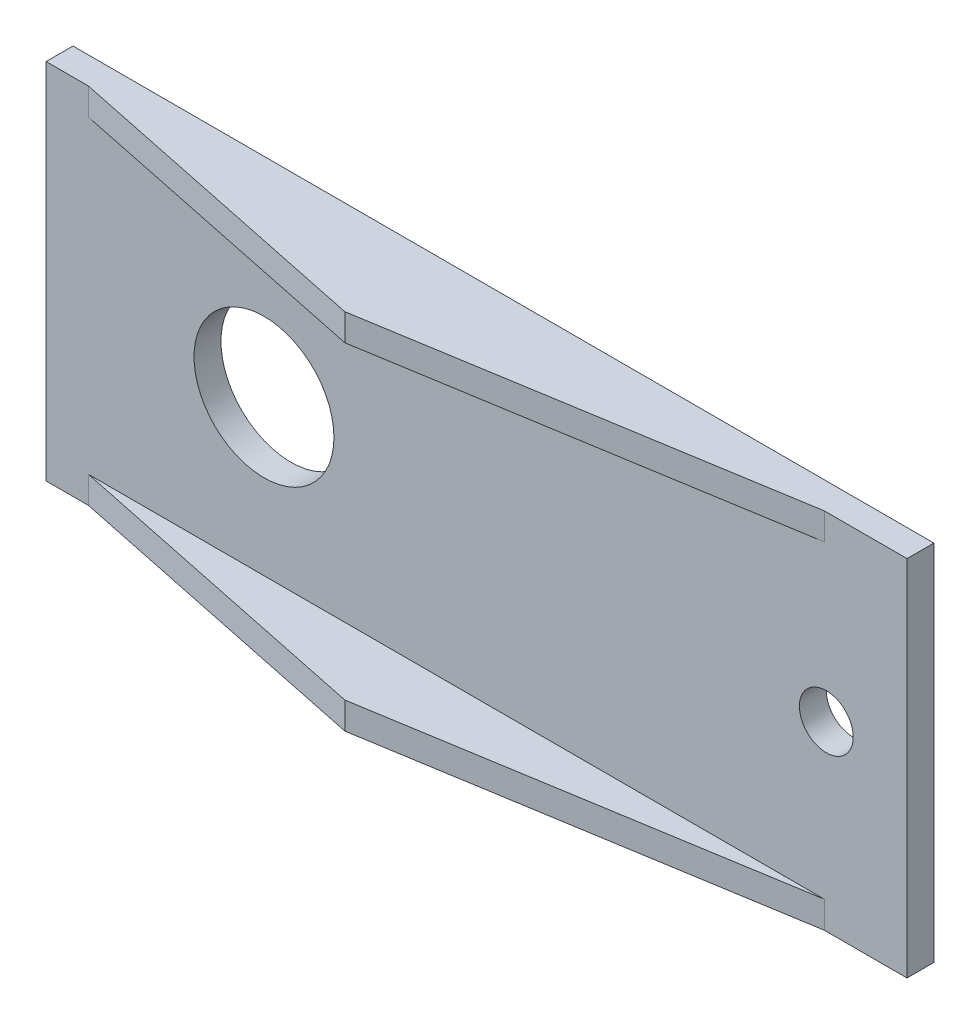
ISO-10303-21;
HEADER;
FILE_DESCRIPTION(('STEP AP214'),'2;1');
FILE_NAME('part.step','',(''),(''),'','','');
FILE_SCHEMA(('AUTOMOTIVE_DESIGN { 1 0 10303 214 1 1 1 1 }'));
ENDSEC;
DATA;
#1=APPLICATION_CONTEXT('core data for automotive mechanical design processes');
#2=APPLICATION_PROTOCOL_DEFINITION('international standard','automotive_design',2000,#1);
#3=PRODUCT_CONTEXT('',#1,'mechanical');
#4=PRODUCT('Part','Part','',(#3));
#5=PRODUCT_RELATED_PRODUCT_CATEGORY('part','',(#4));
#6=PRODUCT_DEFINITION_FORMATION('','',#4);
#7=PRODUCT_DEFINITION_CONTEXT('part definition',#1,'design');
#8=PRODUCT_DEFINITION('design','',#6,#7);
#9=PRODUCT_DEFINITION_SHAPE('','',#8);
#10=(LENGTH_UNIT() NAMED_UNIT(*) SI_UNIT(.MILLI.,.METRE.));
#11=(NAMED_UNIT(*) PLANE_ANGLE_UNIT() SI_UNIT($,.RADIAN.));
#12=(NAMED_UNIT(*) SI_UNIT($,.STERADIAN.) SOLID_ANGLE_UNIT());
#13=UNCERTAINTY_MEASURE_WITH_UNIT(LENGTH_MEASURE(1.E-05),#10,'distance_accuracy_value','');
#14=(GEOMETRIC_REPRESENTATION_CONTEXT(3) GLOBAL_UNCERTAINTY_ASSIGNED_CONTEXT((#13)) GLOBAL_UNIT_ASSIGNED_CONTEXT((#10,
#11,#12)) REPRESENTATION_CONTEXT('',''));
#15=CARTESIAN_POINT('',(0.,0.,0.));
#16=DIRECTION('',(0.,0.,1.));
#17=DIRECTION('',(1.,0.,0.));
#18=AXIS2_PLACEMENT_3D('',#15,#16,#17);
#19=CARTESIAN_POINT('',(0.,0.,1.));
#20=DIRECTION('',(0.,0.,1.));
#21=DIRECTION('',(1.,0.,0.));
#22=AXIS2_PLACEMENT_3D('',#19,#20,#21);
#23=PLANE('',#22);
#24=CARTESIAN_POINT('',(8.1,-6.75,1.));
#25=DIRECTION('',(0.,0.,1.));
#26=DIRECTION('',(1.,0.,0.));
#27=AXIS2_PLACEMENT_3D('',#24,#25,#26);
#28=CIRCLE('',#27,2.6);
#29=CARTESIAN_POINT('',(10.7,-6.75,1.));
#30=VERTEX_POINT('',#29);
#31=EDGE_CURVE('E189',#30,#30,#28,.T.);
#32=ORIENTED_EDGE('',*,*,#31,.F.);
#33=EDGE_LOOP('',(#32));
#34=FACE_BOUND('',#33,.T.);
#35=CARTESIAN_POINT('',(29.,-6.75,1.));
#36=DIRECTION('',(0.,0.,1.));
#37=DIRECTION('',(1.,0.,0.));
#38=AXIS2_PLACEMENT_3D('',#35,#36,#37);
#39=CIRCLE('',#38,1.);
#40=CARTESIAN_POINT('',(30.,-6.75,1.));
#41=VERTEX_POINT('',#40);
#42=EDGE_CURVE('E181',#41,#41,#39,.T.);
#43=ORIENTED_EDGE('',*,*,#42,.F.);
#44=EDGE_LOOP('',(#43));
#45=FACE_BOUND('',#44,.T.);
#46=DIRECTION('',(1.,0.,0.));
#47=VECTOR('',#46,1.);
#48=CARTESIAN_POINT('',(0.,-13.5,1.));
#49=LINE('',#48,#47);
#50=CARTESIAN_POINT('',(0.,-13.5,1.));
#51=VERTEX_POINT('',#50);
#52=CARTESIAN_POINT('',(1.57152439507513,-13.5,1.));
#53=VERTEX_POINT('',#52);
#54=EDGE_CURVE('E203',#51,#53,#49,.T.);
#55=ORIENTED_EDGE('',*,*,#54,.T.);
#56=DIRECTION('',(0.,-1.,0.));
#57=VECTOR('',#56,1.);
#58=CARTESIAN_POINT('',(1.57152439507513,-12.5,1.));
#59=LINE('',#58,#57);
#60=CARTESIAN_POINT('',(1.57152439507513,-12.5,1.));
#61=VERTEX_POINT('',#60);
#62=EDGE_CURVE('E55',#61,#53,#59,.T.);
#63=ORIENTED_EDGE('',*,*,#62,.F.);
#64=DIRECTION('',(-1.,0.,0.));
#65=VECTOR('',#64,1.);
#66=CARTESIAN_POINT('',(1.57152439507513,-12.5,1.));
#67=LINE('',#66,#65);
#68=CARTESIAN_POINT('',(28.9267410776262,-12.5,1.));
#69=VERTEX_POINT('',#68);
#70=EDGE_CURVE('E60',#69,#61,#67,.T.);
#71=ORIENTED_EDGE('',*,*,#70,.F.);
#72=DIRECTION('',(0.,-1.,0.));
#73=VECTOR('',#72,1.);
#74=CARTESIAN_POINT('',(28.9267410776262,-12.5,1.));
#75=LINE('',#74,#73);
#76=CARTESIAN_POINT('',(28.9267410776262,-13.5,1.));
#77=VERTEX_POINT('',#76);
#78=EDGE_CURVE('E123',#69,#77,#75,.T.);
#79=ORIENTED_EDGE('',*,*,#78,.T.);
#80=CARTESIAN_POINT('',(32.,-13.5,1.));
#81=VERTEX_POINT('',#80);
#82=EDGE_CURVE('E201',#77,#81,#49,.T.);
#83=ORIENTED_EDGE('',*,*,#82,.T.);
#84=DIRECTION('',(0.,1.,0.));
#85=VECTOR('',#84,1.);
#86=CARTESIAN_POINT('',(32.,0.,1.));
#87=LINE('',#86,#85);
#88=CARTESIAN_POINT('',(32.,0.,1.));
#89=VERTEX_POINT('',#88);
#90=EDGE_CURVE('E206',#81,#89,#87,.T.);
#91=ORIENTED_EDGE('',*,*,#90,.T.);
#92=DIRECTION('',(-1.,0.,0.));
#93=VECTOR('',#92,1.);
#94=CARTESIAN_POINT('',(0.,0.,1.));
#95=LINE('',#94,#93);
#96=CARTESIAN_POINT('',(28.9267410776262,0.,1.));
#97=VERTEX_POINT('',#96);
#98=EDGE_CURVE('E210',#89,#97,#95,.T.);
#99=ORIENTED_EDGE('',*,*,#98,.T.);
#100=DIRECTION('',(0.,1.,0.));
#101=VECTOR('',#100,1.);
#102=CARTESIAN_POINT('',(28.9267410776262,-1.,1.));
#103=LINE('',#102,#101);
#104=CARTESIAN_POINT('',(28.9267410776262,-1.,1.));
#105=VERTEX_POINT('',#104);
#106=EDGE_CURVE('E171',#105,#97,#103,.T.);
#107=ORIENTED_EDGE('',*,*,#106,.F.);
#108=DIRECTION('',(-1.,0.,0.));
#109=VECTOR('',#108,1.);
#110=CARTESIAN_POINT('',(1.57152439507513,-1.,1.));
#111=LINE('',#110,#109);
#112=CARTESIAN_POINT('',(1.57152439507513,-1.,1.));
#113=VERTEX_POINT('',#112);
#114=EDGE_CURVE('E151',#105,#113,#111,.T.);
#115=ORIENTED_EDGE('',*,*,#114,.T.);
#116=DIRECTION('',(0.,1.,0.));
#117=VECTOR('',#116,1.);
#118=CARTESIAN_POINT('',(1.57152439507513,-1.,1.));
#119=LINE('',#118,#117);
#120=CARTESIAN_POINT('',(1.57152439507513,0.,1.));
#121=VERTEX_POINT('',#120);
#122=EDGE_CURVE('E164',#113,#121,#119,.T.);
#123=ORIENTED_EDGE('',*,*,#122,.T.);
#124=CARTESIAN_POINT('',(0.,0.,1.));
#125=VERTEX_POINT('',#124);
#126=EDGE_CURVE('E209',#121,#125,#95,.T.);
#127=ORIENTED_EDGE('',*,*,#126,.T.);
#128=DIRECTION('',(0.,-1.,0.));
#129=VECTOR('',#128,1.);
#130=CARTESIAN_POINT('',(0.,0.,1.));
#131=LINE('',#130,#129);
#132=EDGE_CURVE('E197',#125,#51,#131,.T.);
#133=ORIENTED_EDGE('',*,*,#132,.T.);
#134=EDGE_LOOP('',(#55,#63,#71,#79,#83,#91,#99,#107,#115,#123,#127,#133));
#135=FACE_BOUND('',#134,.T.);
#136=ADVANCED_FACE('F39',(#34,#45,#135),#23,.T.);
#137=CARTESIAN_POINT('',(0.,0.,0.));
#138=DIRECTION('',(0.,0.,1.));
#139=DIRECTION('',(1.,0.,0.));
#140=AXIS2_PLACEMENT_3D('',#137,#138,#139);
#141=PLANE('',#140);
#142=DIRECTION('',(0.,-1.,0.));
#143=VECTOR('',#142,1.);
#144=CARTESIAN_POINT('',(0.,0.,0.));
#145=LINE('',#144,#143);
#146=CARTESIAN_POINT('',(0.,0.,0.));
#147=VERTEX_POINT('',#146);
#148=CARTESIAN_POINT('',(0.,-13.5,0.));
#149=VERTEX_POINT('',#148);
#150=EDGE_CURVE('E193',#147,#149,#145,.T.);
#151=ORIENTED_EDGE('',*,*,#150,.F.);
#152=DIRECTION('',(-1.,0.,0.));
#153=VECTOR('',#152,1.);
#154=CARTESIAN_POINT('',(0.,0.,0.));
#155=LINE('',#154,#153);
#156=CARTESIAN_POINT('',(32.,0.,0.));
#157=VERTEX_POINT('',#156);
#158=EDGE_CURVE('E202',#157,#147,#155,.T.);
#159=ORIENTED_EDGE('',*,*,#158,.F.);
#160=DIRECTION('',(0.,1.,0.));
#161=VECTOR('',#160,1.);
#162=CARTESIAN_POINT('',(32.,0.,0.));
#163=LINE('',#162,#161);
#164=CARTESIAN_POINT('',(32.,-13.5,0.));
#165=VERTEX_POINT('',#164);
#166=EDGE_CURVE('E221',#165,#157,#163,.T.);
#167=ORIENTED_EDGE('',*,*,#166,.F.);
#168=DIRECTION('',(1.,0.,0.));
#169=VECTOR('',#168,1.);
#170=CARTESIAN_POINT('',(0.,-13.5,0.));
#171=LINE('',#170,#169);
#172=EDGE_CURVE('E218',#149,#165,#171,.T.);
#173=ORIENTED_EDGE('',*,*,#172,.F.);
#174=EDGE_LOOP('',(#151,#159,#167,#173));
#175=FACE_BOUND('',#174,.T.);
#176=CARTESIAN_POINT('',(8.1,-6.75,0.));
#177=DIRECTION('',(0.,0.,1.));
#178=DIRECTION('',(1.,0.,0.));
#179=AXIS2_PLACEMENT_3D('',#176,#177,#178);
#180=CIRCLE('',#179,2.6);
#181=CARTESIAN_POINT('',(10.7,-6.75,0.));
#182=VERTEX_POINT('',#181);
#183=EDGE_CURVE('E185',#182,#182,#180,.T.);
#184=ORIENTED_EDGE('',*,*,#183,.T.);
#185=EDGE_LOOP('',(#184));
#186=FACE_BOUND('',#185,.T.);
#187=CARTESIAN_POINT('',(29.,-6.75,0.));
#188=DIRECTION('',(0.,0.,1.));
#189=DIRECTION('',(1.,0.,0.));
#190=AXIS2_PLACEMENT_3D('',#187,#188,#189);
#191=CIRCLE('',#190,1.);
#192=CARTESIAN_POINT('',(30.,-6.75,0.));
#193=VERTEX_POINT('',#192);
#194=EDGE_CURVE('E174',#193,#193,#191,.T.);
#195=ORIENTED_EDGE('',*,*,#194,.T.);
#196=EDGE_LOOP('',(#195));
#197=FACE_BOUND('',#196,.T.);
#198=ADVANCED_FACE('F244',(#175,#186,#197),#141,.F.);
#199=CARTESIAN_POINT('',(0.,0.,1.));
#200=DIRECTION('',(1.,0.,0.));
#201=DIRECTION('',(0.,1.,0.));
#202=AXIS2_PLACEMENT_3D('',#199,#200,#201);
#203=PLANE('',#202);
#204=ORIENTED_EDGE('',*,*,#150,.T.);
#205=DIRECTION('',(0.,0.,-1.));
#206=VECTOR('',#205,1.);
#207=CARTESIAN_POINT('',(0.,-13.5,1.));
#208=LINE('',#207,#206);
#209=EDGE_CURVE('E11',#51,#149,#208,.T.);
#210=ORIENTED_EDGE('',*,*,#209,.F.);
#211=ORIENTED_EDGE('',*,*,#132,.F.);
#212=DIRECTION('',(0.,0.,-1.));
#213=VECTOR('',#212,1.);
#214=CARTESIAN_POINT('',(0.,0.,1.));
#215=LINE('',#214,#213);
#216=EDGE_CURVE('E214',#125,#147,#215,.T.);
#217=ORIENTED_EDGE('',*,*,#216,.T.);
#218=EDGE_LOOP('',(#204,#210,#211,#217));
#219=FACE_BOUND('',#218,.T.);
#220=ADVANCED_FACE('F41',(#219),#203,.F.);
#221=CARTESIAN_POINT('',(0.,-13.5,1.));
#222=DIRECTION('',(0.,1.,0.));
#223=DIRECTION('',(0.,0.,1.));
#224=AXIS2_PLACEMENT_3D('',#221,#222,#223);
#225=PLANE('',#224);
#226=ORIENTED_EDGE('',*,*,#172,.T.);
#227=DIRECTION('',(0.,0.,-1.));
#228=VECTOR('',#227,1.);
#229=CARTESIAN_POINT('',(32.,-13.5,1.));
#230=LINE('',#229,#228);
#231=EDGE_CURVE('E48',#81,#165,#230,.T.);
#232=ORIENTED_EDGE('',*,*,#231,.F.);
#233=ORIENTED_EDGE('',*,*,#82,.F.);
#234=DIRECTION('',(0.986946577143755,0.,-0.161047986215992));
#235=VECTOR('',#234,1.);
#236=CARTESIAN_POINT('',(13.6060500163282,-13.5,3.5));
#237=LINE('',#236,#235);
#238=CARTESIAN_POINT('',(13.6060500163282,-13.5,3.5));
#239=VERTEX_POINT('',#238);
#240=EDGE_CURVE('E141',#239,#77,#237,.T.);
#241=ORIENTED_EDGE('',*,*,#240,.F.);
#242=DIRECTION('',(0.979097102389324,0.,0.20339337278493));
#243=VECTOR('',#242,1.);
#244=CARTESIAN_POINT('',(1.57152439507513,-13.5,1.));
#245=LINE('',#244,#243);
#246=EDGE_CURVE('E129',#53,#239,#245,.T.);
#247=ORIENTED_EDGE('',*,*,#246,.F.);
#248=ORIENTED_EDGE('',*,*,#54,.F.);
#249=ORIENTED_EDGE('',*,*,#209,.T.);
#250=EDGE_LOOP('',(#226,#232,#233,#241,#247,#248,#249));
#251=FACE_BOUND('',#250,.T.);
#252=ADVANCED_FACE('F256',(#251),#225,.F.);
#253=CARTESIAN_POINT('',(32.,0.,1.));
#254=DIRECTION('',(-1.,0.,0.));
#255=DIRECTION('',(0.,0.,1.));
#256=AXIS2_PLACEMENT_3D('',#253,#254,#255);
#257=PLANE('',#256);
#258=ORIENTED_EDGE('',*,*,#166,.T.);
#259=DIRECTION('',(0.,0.,-1.));
#260=VECTOR('',#259,1.);
#261=CARTESIAN_POINT('',(32.,0.,1.));
#262=LINE('',#261,#260);
#263=EDGE_CURVE('E229',#89,#157,#262,.T.);
#264=ORIENTED_EDGE('',*,*,#263,.F.);
#265=ORIENTED_EDGE('',*,*,#90,.F.);
#266=ORIENTED_EDGE('',*,*,#231,.T.);
#267=EDGE_LOOP('',(#258,#264,#265,#266));
#268=FACE_BOUND('',#267,.T.);
#269=ADVANCED_FACE('F238',(#268),#257,.F.);
#270=CARTESIAN_POINT('',(0.,0.,1.));
#271=DIRECTION('',(0.,-1.,0.));
#272=DIRECTION('',(0.,0.,-1.));
#273=AXIS2_PLACEMENT_3D('',#270,#271,#272);
#274=PLANE('',#273);
#275=ORIENTED_EDGE('',*,*,#158,.T.);
#276=ORIENTED_EDGE('',*,*,#216,.F.);
#277=ORIENTED_EDGE('',*,*,#126,.F.);
#278=DIRECTION('',(0.979097102389324,0.,0.20339337278493));
#279=VECTOR('',#278,1.);
#280=CARTESIAN_POINT('',(1.57152439507513,0.,1.));
#281=LINE('',#280,#279);
#282=CARTESIAN_POINT('',(13.6060500163282,0.,3.5));
#283=VERTEX_POINT('',#282);
#284=EDGE_CURVE('E147',#121,#283,#281,.T.);
#285=ORIENTED_EDGE('',*,*,#284,.T.);
#286=DIRECTION('',(0.986946577143755,0.,-0.161047986215992));
#287=VECTOR('',#286,1.);
#288=CARTESIAN_POINT('',(13.6060500163282,0.,3.5));
#289=LINE('',#288,#287);
#290=EDGE_CURVE('E156',#283,#97,#289,.T.);
#291=ORIENTED_EDGE('',*,*,#290,.T.);
#292=ORIENTED_EDGE('',*,*,#98,.F.);
#293=ORIENTED_EDGE('',*,*,#263,.T.);
#294=EDGE_LOOP('',(#275,#276,#277,#285,#291,#292,#293));
#295=FACE_BOUND('',#294,.T.);
#296=ADVANCED_FACE('F248',(#295),#274,.F.);
#297=CARTESIAN_POINT('',(8.1,-6.75,1.));
#298=DIRECTION('',(0.,0.,-1.));
#299=DIRECTION('',(-1.,0.,0.));
#300=AXIS2_PLACEMENT_3D('',#297,#298,#299);
#301=CYLINDRICAL_SURFACE('',#300,2.6);
#302=ORIENTED_EDGE('',*,*,#31,.T.);
#303=EDGE_LOOP('',(#302));
#304=FACE_BOUND('',#303,.T.);
#305=ORIENTED_EDGE('',*,*,#183,.F.);
#306=EDGE_LOOP('',(#305));
#307=FACE_BOUND('',#306,.T.);
#308=ADVANCED_FACE('F273',(#304,#307),#301,.F.);
#309=CARTESIAN_POINT('',(29.,-6.75,1.));
#310=DIRECTION('',(0.,0.,-1.));
#311=DIRECTION('',(-1.,0.,0.));
#312=AXIS2_PLACEMENT_3D('',#309,#310,#311);
#313=CYLINDRICAL_SURFACE('',#312,1.);
#314=ORIENTED_EDGE('',*,*,#42,.T.);
#315=EDGE_LOOP('',(#314));
#316=FACE_BOUND('',#315,.T.);
#317=ORIENTED_EDGE('',*,*,#194,.F.);
#318=EDGE_LOOP('',(#317));
#319=FACE_BOUND('',#318,.T.);
#320=ADVANCED_FACE('F280',(#316,#319),#313,.F.);
#321=CARTESIAN_POINT('',(13.6060500163282,-1.,3.5));
#322=DIRECTION('',(0.161047986215992,0.,0.986946577143755));
#323=DIRECTION('',(0.986946577143755,0.,-0.161047986215992));
#324=AXIS2_PLACEMENT_3D('',#321,#322,#323);
#325=PLANE('',#324);
#326=ORIENTED_EDGE('',*,*,#290,.F.);
#327=DIRECTION('',(0.,1.,0.));
#328=VECTOR('',#327,1.);
#329=CARTESIAN_POINT('',(13.6060500163282,-1.,3.5));
#330=LINE('',#329,#328);
#331=CARTESIAN_POINT('',(13.6060500163282,-1.,3.5));
#332=VERTEX_POINT('',#331);
#333=EDGE_CURVE('E175',#332,#283,#330,.T.);
#334=ORIENTED_EDGE('',*,*,#333,.F.);
#335=DIRECTION('',(0.986946577143755,0.,-0.161047986215992));
#336=VECTOR('',#335,1.);
#337=CARTESIAN_POINT('',(13.6060500163282,-1.,3.5));
#338=LINE('',#337,#336);
#339=EDGE_CURVE('E160',#332,#105,#338,.T.);
#340=ORIENTED_EDGE('',*,*,#339,.T.);
#341=ORIENTED_EDGE('',*,*,#106,.T.);
#342=EDGE_LOOP('',(#326,#334,#340,#341));
#343=FACE_BOUND('',#342,.T.);
#344=ADVANCED_FACE('F285',(#343),#325,.T.);
#345=CARTESIAN_POINT('',(1.57152439507513,-1.,1.));
#346=DIRECTION('',(-0.20339337278493,0.,0.979097102389324));
#347=DIRECTION('',(0.979097102389324,0.,0.20339337278493));
#348=AXIS2_PLACEMENT_3D('',#345,#346,#347);
#349=PLANE('',#348);
#350=ORIENTED_EDGE('',*,*,#284,.F.);
#351=ORIENTED_EDGE('',*,*,#122,.F.);
#352=DIRECTION('',(0.979097102389324,0.,0.20339337278493));
#353=VECTOR('',#352,1.);
#354=CARTESIAN_POINT('',(1.57152439507513,-1.,1.));
#355=LINE('',#354,#353);
#356=EDGE_CURVE('E155',#113,#332,#355,.T.);
#357=ORIENTED_EDGE('',*,*,#356,.T.);
#358=ORIENTED_EDGE('',*,*,#333,.T.);
#359=EDGE_LOOP('',(#350,#351,#357,#358));
#360=FACE_BOUND('',#359,.T.);
#361=ADVANCED_FACE('F295',(#360),#349,.T.);
#362=CARTESIAN_POINT('',(0.,-1.,0.));
#363=DIRECTION('',(0.,-1.,0.));
#364=DIRECTION('',(0.,0.,-1.));
#365=AXIS2_PLACEMENT_3D('',#362,#363,#364);
#366=PLANE('',#365);
#367=ORIENTED_EDGE('',*,*,#114,.F.);
#368=ORIENTED_EDGE('',*,*,#339,.F.);
#369=ORIENTED_EDGE('',*,*,#356,.F.);
#370=EDGE_LOOP('',(#367,#368,#369));
#371=FACE_BOUND('',#370,.T.);
#372=ADVANCED_FACE('F300',(#371),#366,.T.);
#373=CARTESIAN_POINT('',(1.57152439507513,-12.5,1.));
#374=DIRECTION('',(0.20339337278493,0.,-0.979097102389324));
#375=DIRECTION('',(-0.979097102389324,0.,-0.20339337278493));
#376=AXIS2_PLACEMENT_3D('',#373,#374,#375);
#377=PLANE('',#376);
#378=ORIENTED_EDGE('',*,*,#246,.T.);
#379=DIRECTION('',(0.,-1.,0.));
#380=VECTOR('',#379,1.);
#381=CARTESIAN_POINT('',(13.6060500163282,-12.5,3.5));
#382=LINE('',#381,#380);
#383=CARTESIAN_POINT('',(13.6060500163282,-12.5,3.5));
#384=VERTEX_POINT('',#383);
#385=EDGE_CURVE('E126',#384,#239,#382,.T.);
#386=ORIENTED_EDGE('',*,*,#385,.F.);
#387=DIRECTION('',(0.979097102389324,0.,0.20339337278493));
#388=VECTOR('',#387,1.);
#389=CARTESIAN_POINT('',(1.57152439507513,-12.5,1.));
#390=LINE('',#389,#388);
#391=EDGE_CURVE('E115',#61,#384,#390,.T.);
#392=ORIENTED_EDGE('',*,*,#391,.F.);
#393=ORIENTED_EDGE('',*,*,#62,.T.);
#394=EDGE_LOOP('',(#378,#386,#392,#393));
#395=FACE_BOUND('',#394,.T.);
#396=ADVANCED_FACE('F127',(#395),#377,.F.);
#397=CARTESIAN_POINT('',(13.6060500163282,-12.5,3.5));
#398=DIRECTION('',(-0.161047986215992,0.,-0.986946577143755));
#399=DIRECTION('',(-0.986946577143755,0.,0.161047986215992));
#400=AXIS2_PLACEMENT_3D('',#397,#398,#399);
#401=PLANE('',#400);
#402=ORIENTED_EDGE('',*,*,#240,.T.);
#403=ORIENTED_EDGE('',*,*,#78,.F.);
#404=DIRECTION('',(0.986946577143755,0.,-0.161047986215992));
#405=VECTOR('',#404,1.);
#406=CARTESIAN_POINT('',(13.6060500163282,-12.5,3.5));
#407=LINE('',#406,#405);
#408=EDGE_CURVE('E119',#384,#69,#407,.T.);
#409=ORIENTED_EDGE('',*,*,#408,.F.);
#410=ORIENTED_EDGE('',*,*,#385,.T.);
#411=EDGE_LOOP('',(#402,#403,#409,#410));
#412=FACE_BOUND('',#411,.T.);
#413=ADVANCED_FACE('F135',(#412),#401,.F.);
#414=CARTESIAN_POINT('',(0.,-12.5,0.));
#415=DIRECTION('',(0.,1.,0.));
#416=DIRECTION('',(0.,0.,-1.));
#417=AXIS2_PLACEMENT_3D('',#414,#415,#416);
#418=PLANE('',#417);
#419=ORIENTED_EDGE('',*,*,#70,.T.);
#420=ORIENTED_EDGE('',*,*,#391,.T.);
#421=ORIENTED_EDGE('',*,*,#408,.T.);
#422=EDGE_LOOP('',(#419,#420,#421));
#423=FACE_BOUND('',#422,.T.);
#424=ADVANCED_FACE('F117',(#423),#418,.T.);
#425=CLOSED_SHELL('',(#136,#198,#220,#252,#269,#296,#308,#320,#344,#361,#372,#396,#413,#424));
#426=MANIFOLD_SOLID_BREP('B2',#425);
#427=ADVANCED_BREP_SHAPE_REPRESENTATION('',(#18,#426),#14);
#428=SHAPE_DEFINITION_REPRESENTATION(#9,#427);
ENDSEC;
END-ISO-10303-21;
